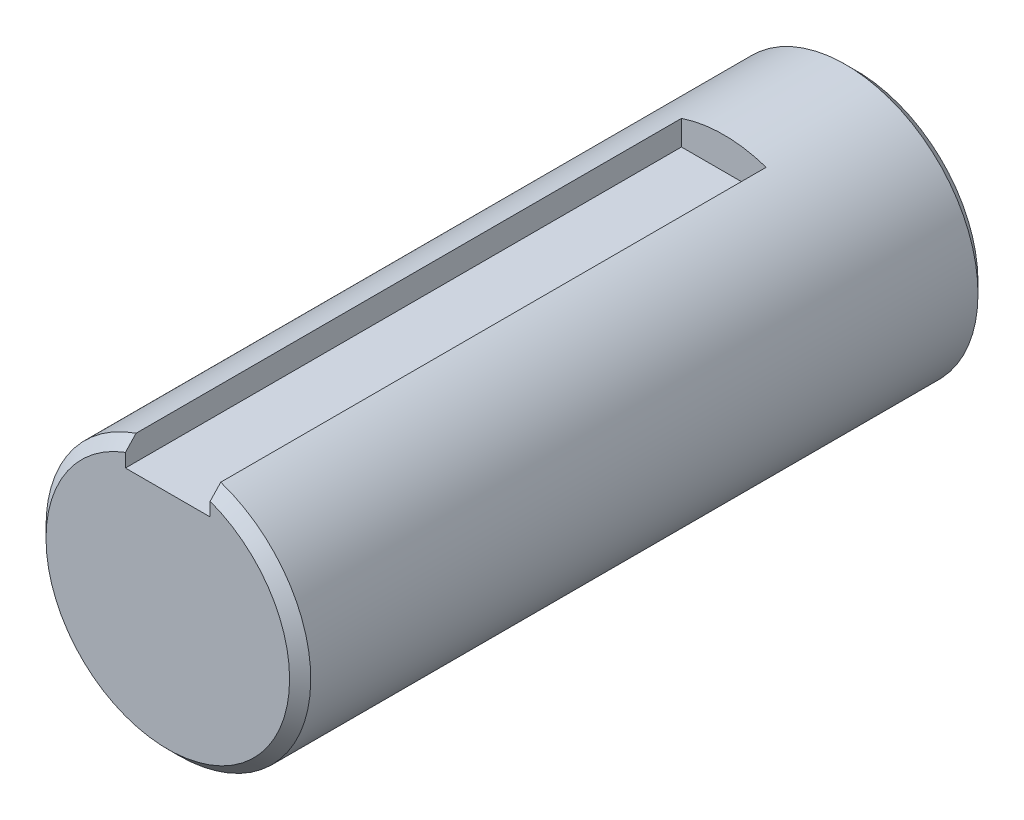
ISO-10303-21;
HEADER;
FILE_DESCRIPTION(('STEP AP214'),'2;1');
FILE_NAME('part.step','',(''),(''),'','','');
FILE_SCHEMA(('AUTOMOTIVE_DESIGN { 1 0 10303 214 1 1 1 1 }'));
ENDSEC;
DATA;
#1=APPLICATION_CONTEXT('core data for automotive mechanical design processes');
#2=APPLICATION_PROTOCOL_DEFINITION('international standard','automotive_design',2000,#1);
#3=PRODUCT_CONTEXT('',#1,'mechanical');
#4=PRODUCT('Part','Part','',(#3));
#5=PRODUCT_RELATED_PRODUCT_CATEGORY('part','',(#4));
#6=PRODUCT_DEFINITION_FORMATION('','',#4);
#7=PRODUCT_DEFINITION_CONTEXT('part definition',#1,'design');
#8=PRODUCT_DEFINITION('design','',#6,#7);
#9=PRODUCT_DEFINITION_SHAPE('','',#8);
#10=(LENGTH_UNIT() NAMED_UNIT(*) SI_UNIT(.MILLI.,.METRE.));
#11=(NAMED_UNIT(*) PLANE_ANGLE_UNIT() SI_UNIT($,.RADIAN.));
#12=(NAMED_UNIT(*) SI_UNIT($,.STERADIAN.) SOLID_ANGLE_UNIT());
#13=UNCERTAINTY_MEASURE_WITH_UNIT(LENGTH_MEASURE(1.E-05),#10,'distance_accuracy_value','');
#14=(GEOMETRIC_REPRESENTATION_CONTEXT(3) GLOBAL_UNCERTAINTY_ASSIGNED_CONTEXT((#13)) GLOBAL_UNIT_ASSIGNED_CONTEXT((#10,
#11,#12)) REPRESENTATION_CONTEXT('',''));
#15=CARTESIAN_POINT('',(0.,0.,0.));
#16=DIRECTION('',(0.,0.,1.));
#17=DIRECTION('',(1.,0.,0.));
#18=AXIS2_PLACEMENT_3D('',#15,#16,#17);
#19=CARTESIAN_POINT('',(8.,19.,130.));
#20=DIRECTION('',(1.,0.,0.));
#21=DIRECTION('',(0.,0.,-1.));
#22=AXIS2_PLACEMENT_3D('',#19,#20,#21);
#23=PLANE('',#22);
#24=DIRECTION('',(0.,-1.,0.));
#25=VECTOR('',#24,1.);
#26=CARTESIAN_POINT('',(8.,19.,130.));
#27=LINE('',#26,#25);
#28=CARTESIAN_POINT('',(8.,21.5638586528478,130.));
#29=VERTEX_POINT('',#28);
#30=CARTESIAN_POINT('',(8.,19.,130.));
#31=VERTEX_POINT('',#30);
#32=EDGE_CURVE('E99',#29,#31,#27,.T.);
#33=ORIENTED_EDGE('',*,*,#32,.F.);
#34=CARTESIAN_POINT('',(8.,21.5638586528478,130.));
#35=CARTESIAN_POINT('',(8.,21.7411107364013,129.833815221234));
#36=CARTESIAN_POINT('',(8.,21.9182395858736,129.667499050364));
#37=CARTESIAN_POINT('',(8.,22.2722654969859,129.334620790228));
#38=CARTESIAN_POINT('',(8.,22.4491625590192,129.16805870138));
#39=CARTESIAN_POINT('',(8.,22.8027401426305,128.834704939434));
#40=CARTESIAN_POINT('',(8.,22.9794206642512,128.66791326638));
#41=CARTESIAN_POINT('',(8.,23.332578673005,128.334114504008));
#42=CARTESIAN_POINT('',(8.,23.5090561597927,128.167107414323));
#43=CARTESIAN_POINT('',(8.,23.685438564654,128.));
#44=B_SPLINE_CURVE_WITH_KNOTS('',3,(#34,#35,#36,#37,#38,#39,#40,#41,#42,#43),.UNSPECIFIED.,.F.,
.F.,(4,2,2,2,4),(0.,0.728917669389517,1.45783410081456,2.18675038823141,2.91566791341968),.UNSPECIFIED.);
#45=CARTESIAN_POINT('',(8.,23.685438564654,128.));
#46=VERTEX_POINT('',#45);
#47=EDGE_CURVE('E61',#29,#46,#44,.T.);
#48=ORIENTED_EDGE('',*,*,#47,.T.);
#49=DIRECTION('',(0.,0.,-1.));
#50=VECTOR('',#49,1.);
#51=CARTESIAN_POINT('',(8.,23.685438564654,130.));
#52=LINE('',#51,#50);
#53=CARTESIAN_POINT('',(8.,23.685438564654,25.));
#54=VERTEX_POINT('',#53);
#55=EDGE_CURVE('E117',#46,#54,#52,.T.);
#56=ORIENTED_EDGE('',*,*,#55,.T.);
#57=DIRECTION('',(0.,-1.,0.));
#58=VECTOR('',#57,1.);
#59=CARTESIAN_POINT('',(8.,23.685438564654,25.));
#60=LINE('',#59,#58);
#61=CARTESIAN_POINT('',(8.,19.,25.));
#62=VERTEX_POINT('',#61);
#63=EDGE_CURVE('E113',#54,#62,#60,.T.);
#64=ORIENTED_EDGE('',*,*,#63,.T.);
#65=DIRECTION('',(0.,0.,-1.));
#66=VECTOR('',#65,1.);
#67=CARTESIAN_POINT('',(8.,19.,130.));
#68=LINE('',#67,#66);
#69=EDGE_CURVE('E111',#31,#62,#68,.T.);
#70=ORIENTED_EDGE('',*,*,#69,.F.);
#71=EDGE_LOOP('',(#33,#48,#56,#64,#70));
#72=FACE_BOUND('',#71,.T.);
#73=ADVANCED_FACE('F45',(#72),#23,.F.);
#74=CARTESIAN_POINT('',(-8.,19.,130.));
#75=DIRECTION('',(0.,-1.,0.));
#76=DIRECTION('',(1.,0.,0.));
#77=AXIS2_PLACEMENT_3D('',#74,#75,#76);
#78=PLANE('',#77);
#79=DIRECTION('',(-1.,0.,0.));
#80=VECTOR('',#79,1.);
#81=CARTESIAN_POINT('',(8.,19.,25.));
#82=LINE('',#81,#80);
#83=CARTESIAN_POINT('',(-8.,19.,25.));
#84=VERTEX_POINT('',#83);
#85=EDGE_CURVE('E185',#62,#84,#82,.T.);
#86=ORIENTED_EDGE('',*,*,#85,.T.);
#87=DIRECTION('',(0.,0.,-1.));
#88=VECTOR('',#87,1.);
#89=CARTESIAN_POINT('',(-8.,19.,130.));
#90=LINE('',#89,#88);
#91=CARTESIAN_POINT('',(-8.,19.,130.));
#92=VERTEX_POINT('',#91);
#93=EDGE_CURVE('E118',#92,#84,#90,.T.);
#94=ORIENTED_EDGE('',*,*,#93,.F.);
#95=DIRECTION('',(-1.,0.,0.));
#96=VECTOR('',#95,1.);
#97=CARTESIAN_POINT('',(-8.,19.,130.));
#98=LINE('',#97,#96);
#99=EDGE_CURVE('E103',#31,#92,#98,.T.);
#100=ORIENTED_EDGE('',*,*,#99,.F.);
#101=ORIENTED_EDGE('',*,*,#69,.T.);
#102=EDGE_LOOP('',(#86,#94,#100,#101));
#103=FACE_BOUND('',#102,.T.);
#104=ADVANCED_FACE('F120',(#103),#78,.F.);
#105=CARTESIAN_POINT('',(-8.,19.,130.));
#106=DIRECTION('',(-1.,0.,0.));
#107=DIRECTION('',(0.,0.,1.));
#108=AXIS2_PLACEMENT_3D('',#105,#106,#107);
#109=PLANE('',#108);
#110=DIRECTION('',(0.,0.,-1.));
#111=VECTOR('',#110,1.);
#112=CARTESIAN_POINT('',(-8.,23.685438564654,130.));
#113=LINE('',#112,#111);
#114=CARTESIAN_POINT('',(-8.,23.685438564654,128.));
#115=VERTEX_POINT('',#114);
#116=CARTESIAN_POINT('',(-8.,23.685438564654,25.));
#117=VERTEX_POINT('',#116);
#118=EDGE_CURVE('E126',#115,#117,#113,.T.);
#119=ORIENTED_EDGE('',*,*,#118,.F.);
#120=CARTESIAN_POINT('',(-8.,23.685438564654,128.));
#121=CARTESIAN_POINT('',(-8.,23.5090561597927,128.167107414323));
#122=CARTESIAN_POINT('',(-8.,23.332578673005,128.334114504008));
#123=CARTESIAN_POINT('',(-8.,22.9794206642512,128.66791326638));
#124=CARTESIAN_POINT('',(-8.,22.8027401426305,128.834704939434));
#125=CARTESIAN_POINT('',(-8.,22.4491625590192,129.16805870138));
#126=CARTESIAN_POINT('',(-8.,22.272265496986,129.334620790228));
#127=CARTESIAN_POINT('',(-8.,21.9182395858736,129.667499050364));
#128=CARTESIAN_POINT('',(-8.,21.7411107364013,129.833815221234));
#129=CARTESIAN_POINT('',(-8.,21.5638586528478,130.));
#130=B_SPLINE_CURVE_WITH_KNOTS('',3,(#120,#121,#122,#123,#124,#125,#126,#127,#128,#129),
.UNSPECIFIED.,.F.,.F.,(4,2,2,2,4),(0.,0.728917525188273,1.45783381260512,2.18675024403013,
2.91566791341968),.UNSPECIFIED.);
#131=CARTESIAN_POINT('',(-8.,21.5638586528478,130.));
#132=VERTEX_POINT('',#131);
#133=EDGE_CURVE('E11',#115,#132,#130,.T.);
#134=ORIENTED_EDGE('',*,*,#133,.T.);
#135=DIRECTION('',(0.,1.,0.));
#136=VECTOR('',#135,1.);
#137=CARTESIAN_POINT('',(-8.,19.,130.));
#138=LINE('',#137,#136);
#139=EDGE_CURVE('E123',#92,#132,#138,.T.);
#140=ORIENTED_EDGE('',*,*,#139,.F.);
#141=ORIENTED_EDGE('',*,*,#93,.T.);
#142=DIRECTION('',(0.,1.,0.));
#143=VECTOR('',#142,1.);
#144=CARTESIAN_POINT('',(-8.,19.,25.));
#145=LINE('',#144,#143);
#146=EDGE_CURVE('E108',#84,#117,#145,.T.);
#147=ORIENTED_EDGE('',*,*,#146,.T.);
#148=EDGE_LOOP('',(#119,#134,#140,#141,#147));
#149=FACE_BOUND('',#148,.T.);
#150=ADVANCED_FACE('F160',(#149),#109,.F.);
#151=CARTESIAN_POINT('',(0.,0.,130.));
#152=DIRECTION('',(0.,0.,-1.));
#153=DIRECTION('',(-1.,0.,0.));
#154=AXIS2_PLACEMENT_3D('',#151,#152,#153);
#155=CYLINDRICAL_SURFACE('',#154,25.);
#156=CARTESIAN_POINT('',(0.,0.,2.));
#157=DIRECTION('',(0.,0.,1.));
#158=DIRECTION('',(1.,0.,0.));
#159=AXIS2_PLACEMENT_3D('',#156,#157,#158);
#160=CIRCLE('',#159,25.);
#161=CARTESIAN_POINT('',(25.,0.,2.));
#162=VERTEX_POINT('',#161);
#163=EDGE_CURVE('E139',#162,#162,#160,.T.);
#164=ORIENTED_EDGE('',*,*,#163,.T.);
#165=EDGE_LOOP('',(#164));
#166=FACE_BOUND('',#165,.T.);
#167=ORIENTED_EDGE('',*,*,#55,.F.);
#168=CARTESIAN_POINT('',(0.,0.,128.));
#169=DIRECTION('',(0.,0.,1.));
#170=DIRECTION('',(1.,0.,0.));
#171=AXIS2_PLACEMENT_3D('',#168,#169,#170);
#172=CIRCLE('',#171,25.);
#173=EDGE_CURVE('E136',#46,#115,#172,.F.);
#174=ORIENTED_EDGE('',*,*,#173,.T.);
#175=ORIENTED_EDGE('',*,*,#118,.T.);
#176=CARTESIAN_POINT('',(0.,0.,25.));
#177=DIRECTION('',(0.,0.,-1.));
#178=DIRECTION('',(-1.,0.,0.));
#179=AXIS2_PLACEMENT_3D('',#176,#177,#178);
#180=CIRCLE('',#179,25.);
#181=EDGE_CURVE('E183',#117,#54,#180,.T.);
#182=ORIENTED_EDGE('',*,*,#181,.T.);
#183=EDGE_LOOP('',(#167,#174,#175,#182));
#184=FACE_BOUND('',#183,.T.);
#185=ADVANCED_FACE('F158',(#166,#184),#155,.T.);
#186=CARTESIAN_POINT('',(0.,0.,130.));
#187=DIRECTION('',(0.,0.,1.));
#188=DIRECTION('',(1.,0.,0.));
#189=AXIS2_PLACEMENT_3D('',#186,#187,#188);
#190=PLANE('',#189);
#191=ORIENTED_EDGE('',*,*,#139,.T.);
#192=CARTESIAN_POINT('',(0.,0.,130.));
#193=DIRECTION('',(0.,0.,1.));
#194=DIRECTION('',(1.,0.,0.));
#195=AXIS2_PLACEMENT_3D('',#192,#193,#194);
#196=CIRCLE('',#195,23.);
#197=EDGE_CURVE('E105',#132,#29,#196,.T.);
#198=ORIENTED_EDGE('',*,*,#197,.T.);
#199=ORIENTED_EDGE('',*,*,#32,.T.);
#200=ORIENTED_EDGE('',*,*,#99,.T.);
#201=EDGE_LOOP('',(#191,#198,#199,#200));
#202=FACE_BOUND('',#201,.T.);
#203=ADVANCED_FACE('F101',(#202),#190,.T.);
#204=CARTESIAN_POINT('',(0.,0.,0.));
#205=DIRECTION('',(0.,0.,1.));
#206=DIRECTION('',(1.,0.,0.));
#207=AXIS2_PLACEMENT_3D('',#204,#205,#206);
#208=PLANE('',#207);
#209=CARTESIAN_POINT('',(0.,0.,0.));
#210=DIRECTION('',(0.,0.,1.));
#211=DIRECTION('',(1.,0.,0.));
#212=AXIS2_PLACEMENT_3D('',#209,#210,#211);
#213=CIRCLE('',#212,23.);
#214=CARTESIAN_POINT('',(23.,0.,0.));
#215=VERTEX_POINT('',#214);
#216=EDGE_CURVE('E143',#215,#215,#213,.F.);
#217=ORIENTED_EDGE('',*,*,#216,.T.);
#218=EDGE_LOOP('',(#217));
#219=FACE_BOUND('',#218,.T.);
#220=ADVANCED_FACE('F173',(#219),#208,.F.);
#221=CARTESIAN_POINT('',(0.,0.,25.));
#222=DIRECTION('',(0.,0.,-1.));
#223=DIRECTION('',(-1.,0.,0.));
#224=AXIS2_PLACEMENT_3D('',#221,#222,#223);
#225=PLANE('',#224);
#226=ORIENTED_EDGE('',*,*,#181,.F.);
#227=ORIENTED_EDGE('',*,*,#146,.F.);
#228=ORIENTED_EDGE('',*,*,#85,.F.);
#229=ORIENTED_EDGE('',*,*,#63,.F.);
#230=EDGE_LOOP('',(#226,#227,#228,#229));
#231=FACE_BOUND('',#230,.T.);
#232=ADVANCED_FACE('F167',(#231),#225,.F.);
#233=CARTESIAN_POINT('',(0.,0.,2.));
#234=DIRECTION('',(0.,0.,1.));
#235=DIRECTION('',(1.,0.,0.));
#236=AXIS2_PLACEMENT_3D('',#233,#234,#235);
#237=CONICAL_SURFACE('',#236,25.,0.785398163397454);
#238=ORIENTED_EDGE('',*,*,#216,.F.);
#239=EDGE_LOOP('',(#238));
#240=FACE_BOUND('',#239,.T.);
#241=ORIENTED_EDGE('',*,*,#163,.F.);
#242=EDGE_LOOP('',(#241));
#243=FACE_BOUND('',#242,.T.);
#244=ADVANCED_FACE('F163',(#240,#243),#237,.T.);
#245=CARTESIAN_POINT('',(0.,0.,130.));
#246=DIRECTION('',(0.,0.,-1.));
#247=DIRECTION('',(-1.,0.,0.));
#248=AXIS2_PLACEMENT_3D('',#245,#246,#247);
#249=CONICAL_SURFACE('',#248,23.,0.78539816339745);
#250=ORIENTED_EDGE('',*,*,#133,.F.);
#251=ORIENTED_EDGE('',*,*,#173,.F.);
#252=ORIENTED_EDGE('',*,*,#47,.F.);
#253=ORIENTED_EDGE('',*,*,#197,.F.);
#254=EDGE_LOOP('',(#250,#251,#252,#253));
#255=FACE_BOUND('',#254,.T.);
#256=ADVANCED_FACE('F48',(#255),#249,.T.);
#257=CLOSED_SHELL('',(#73,#104,#150,#185,#203,#220,#232,#244,#256));
#258=MANIFOLD_SOLID_BREP('B2',#257);
#259=ADVANCED_BREP_SHAPE_REPRESENTATION('',(#18,#258),#14);
#260=SHAPE_DEFINITION_REPRESENTATION(#9,#259);
ENDSEC;
END-ISO-10303-21;
